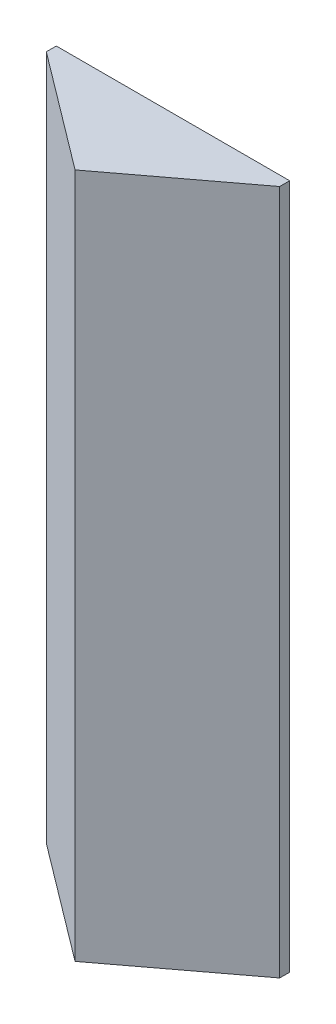
ISO-10303-21;
HEADER;
FILE_DESCRIPTION(('STEP AP214'),'2;1');
FILE_NAME('part.step','',(''),(''),'','','');
FILE_SCHEMA(('AUTOMOTIVE_DESIGN { 1 0 10303 214 1 1 1 1 }'));
ENDSEC;
DATA;
#1=APPLICATION_CONTEXT('core data for automotive mechanical design processes');
#2=APPLICATION_PROTOCOL_DEFINITION('international standard','automotive_design',2000,#1);
#3=PRODUCT_CONTEXT('',#1,'mechanical');
#4=PRODUCT('Part','Part','',(#3));
#5=PRODUCT_RELATED_PRODUCT_CATEGORY('part','',(#4));
#6=PRODUCT_DEFINITION_FORMATION('','',#4);
#7=PRODUCT_DEFINITION_CONTEXT('part definition',#1,'design');
#8=PRODUCT_DEFINITION('design','',#6,#7);
#9=PRODUCT_DEFINITION_SHAPE('','',#8);
#10=(LENGTH_UNIT() NAMED_UNIT(*) SI_UNIT(.MILLI.,.METRE.));
#11=(NAMED_UNIT(*) PLANE_ANGLE_UNIT() SI_UNIT($,.RADIAN.));
#12=(NAMED_UNIT(*) SI_UNIT($,.STERADIAN.) SOLID_ANGLE_UNIT());
#13=UNCERTAINTY_MEASURE_WITH_UNIT(LENGTH_MEASURE(1.E-05),#10,'distance_accuracy_value','');
#14=(GEOMETRIC_REPRESENTATION_CONTEXT(3) GLOBAL_UNCERTAINTY_ASSIGNED_CONTEXT((#13)) GLOBAL_UNIT_ASSIGNED_CONTEXT((#10,
#11,#12)) REPRESENTATION_CONTEXT('',''));
#15=CARTESIAN_POINT('',(0.,0.,0.));
#16=DIRECTION('',(0.,0.,1.));
#17=DIRECTION('',(1.,0.,0.));
#18=AXIS2_PLACEMENT_3D('',#15,#16,#17);
#19=CARTESIAN_POINT('',(0.,1375.,-629.85));
#20=DIRECTION('',(0.,-1.,0.));
#21=DIRECTION('',(1.,0.,0.));
#22=AXIS2_PLACEMENT_3D('',#19,#20,#21);
#23=PLANE('',#22);
#24=DIRECTION('',(0.,0.,1.));
#25=VECTOR('',#24,1.);
#26=CARTESIAN_POINT('',(-357.5,1375.,-614.85));
#27=LINE('',#26,#25);
#28=CARTESIAN_POINT('',(-357.5,1375.,-614.85));
#29=VERTEX_POINT('',#28);
#30=CARTESIAN_POINT('',(-357.5,1375.,-584.245572911746));
#31=VERTEX_POINT('',#30);
#32=EDGE_CURVE('E11',#29,#31,#27,.T.);
#33=ORIENTED_EDGE('',*,*,#32,.T.);
#34=DIRECTION('',(0.798635510047319,0.,0.601815023152014));
#35=VECTOR('',#34,1.);
#36=CARTESIAN_POINT('',(-357.5,1375.,-584.245572911746));
#37=LINE('',#36,#35);
#38=CARTESIAN_POINT('',(0.,1375.,-314.85));
#39=VERTEX_POINT('',#38);
#40=EDGE_CURVE('E28',#31,#39,#37,.T.);
#41=ORIENTED_EDGE('',*,*,#40,.T.);
#42=DIRECTION('',(0.798635510047319,0.,-0.601815023152014));
#43=VECTOR('',#42,1.);
#44=CARTESIAN_POINT('',(0.,1375.,-314.85));
#45=LINE('',#44,#43);
#46=CARTESIAN_POINT('',(357.5,1375.,-584.245572911746));
#47=VERTEX_POINT('',#46);
#48=EDGE_CURVE('E104',#39,#47,#45,.T.);
#49=ORIENTED_EDGE('',*,*,#48,.T.);
#50=DIRECTION('',(0.,0.,-1.));
#51=VECTOR('',#50,1.);
#52=CARTESIAN_POINT('',(357.5,1375.,-584.245572911746));
#53=LINE('',#52,#51);
#54=CARTESIAN_POINT('',(357.5,1375.,-614.85));
#55=VERTEX_POINT('',#54);
#56=EDGE_CURVE('E108',#47,#55,#53,.T.);
#57=ORIENTED_EDGE('',*,*,#56,.T.);
#58=DIRECTION('',(-1.,0.,0.));
#59=VECTOR('',#58,1.);
#60=CARTESIAN_POINT('',(357.5,1375.,-614.85));
#61=LINE('',#60,#59);
#62=EDGE_CURVE('E101',#55,#29,#61,.T.);
#63=ORIENTED_EDGE('',*,*,#62,.T.);
#64=EDGE_LOOP('',(#33,#41,#49,#57,#63));
#65=FACE_BOUND('',#64,.T.);
#66=ADVANCED_FACE('F17',(#65),#23,.F.);
#67=CARTESIAN_POINT('',(357.5,390.,-614.85));
#68=DIRECTION('',(0.,0.,-1.));
#69=DIRECTION('',(0.,1.,0.));
#70=AXIS2_PLACEMENT_3D('',#67,#68,#69);
#71=PLANE('',#70);
#72=ORIENTED_EDGE('',*,*,#62,.F.);
#73=DIRECTION('',(0.,-1.,0.));
#74=VECTOR('',#73,1.);
#75=CARTESIAN_POINT('',(357.5,1375.,-614.85));
#76=LINE('',#75,#74);
#77=CARTESIAN_POINT('',(357.5,-725.,-614.85));
#78=VERTEX_POINT('',#77);
#79=EDGE_CURVE('E97',#55,#78,#76,.T.);
#80=ORIENTED_EDGE('',*,*,#79,.T.);
#81=DIRECTION('',(1.,0.,0.));
#82=VECTOR('',#81,1.);
#83=CARTESIAN_POINT('',(-357.5,-725.,-614.85));
#84=LINE('',#83,#82);
#85=CARTESIAN_POINT('',(-357.5,-725.,-614.85));
#86=VERTEX_POINT('',#85);
#87=EDGE_CURVE('E81',#86,#78,#84,.T.);
#88=ORIENTED_EDGE('',*,*,#87,.F.);
#89=DIRECTION('',(0.,-1.,0.));
#90=VECTOR('',#89,1.);
#91=CARTESIAN_POINT('',(-357.5,1375.,-614.85));
#92=LINE('',#91,#90);
#93=EDGE_CURVE('E76',#29,#86,#92,.T.);
#94=ORIENTED_EDGE('',*,*,#93,.F.);
#95=EDGE_LOOP('',(#72,#80,#88,#94));
#96=FACE_BOUND('',#95,.T.);
#97=ADVANCED_FACE('F19',(#96),#71,.T.);
#98=CARTESIAN_POINT('',(-357.5,390.,-614.85));
#99=DIRECTION('',(-1.,0.,0.));
#100=DIRECTION('',(0.,-1.,0.));
#101=AXIS2_PLACEMENT_3D('',#98,#99,#100);
#102=PLANE('',#101);
#103=ORIENTED_EDGE('',*,*,#32,.F.);
#104=ORIENTED_EDGE('',*,*,#93,.T.);
#105=DIRECTION('',(0.,0.,-1.));
#106=VECTOR('',#105,1.);
#107=CARTESIAN_POINT('',(-357.5,-725.,-584.245572911746));
#108=LINE('',#107,#106);
#109=CARTESIAN_POINT('',(-357.5,-725.,-584.245572911746));
#110=VERTEX_POINT('',#109);
#111=EDGE_CURVE('E71',#110,#86,#108,.T.);
#112=ORIENTED_EDGE('',*,*,#111,.F.);
#113=DIRECTION('',(0.,-1.,0.));
#114=VECTOR('',#113,1.);
#115=CARTESIAN_POINT('',(-357.5,1375.,-584.245572911746));
#116=LINE('',#115,#114);
#117=EDGE_CURVE('E74',#31,#110,#116,.T.);
#118=ORIENTED_EDGE('',*,*,#117,.F.);
#119=EDGE_LOOP('',(#103,#104,#112,#118));
#120=FACE_BOUND('',#119,.T.);
#121=ADVANCED_FACE('F73',(#120),#102,.T.);
#122=CARTESIAN_POINT('',(-357.5,390.,-584.245572911746));
#123=DIRECTION('',(-0.601815023152014,0.,0.798635510047319));
#124=DIRECTION('',(0.,-1.,0.));
#125=AXIS2_PLACEMENT_3D('',#122,#123,#124);
#126=PLANE('',#125);
#127=ORIENTED_EDGE('',*,*,#40,.F.);
#128=ORIENTED_EDGE('',*,*,#117,.T.);
#129=DIRECTION('',(-0.798635510047319,0.,-0.601815023152014));
#130=VECTOR('',#129,1.);
#131=CARTESIAN_POINT('',(0.,-725.,-314.85));
#132=LINE('',#131,#130);
#133=CARTESIAN_POINT('',(0.,-725.,-314.85));
#134=VERTEX_POINT('',#133);
#135=EDGE_CURVE('E63',#134,#110,#132,.T.);
#136=ORIENTED_EDGE('',*,*,#135,.F.);
#137=DIRECTION('',(0.,1.,0.));
#138=VECTOR('',#137,1.);
#139=CARTESIAN_POINT('',(0.,-725.,-314.85));
#140=LINE('',#139,#138);
#141=EDGE_CURVE('E21',#134,#39,#140,.T.);
#142=ORIENTED_EDGE('',*,*,#141,.T.);
#143=EDGE_LOOP('',(#127,#128,#136,#142));
#144=FACE_BOUND('',#143,.T.);
#145=ADVANCED_FACE('F83',(#144),#126,.T.);
#146=CARTESIAN_POINT('',(0.,390.,-314.85));
#147=DIRECTION('',(0.601815023152014,0.,0.798635510047319));
#148=DIRECTION('',(0.,1.,0.));
#149=AXIS2_PLACEMENT_3D('',#146,#147,#148);
#150=PLANE('',#149);
#151=ORIENTED_EDGE('',*,*,#48,.F.);
#152=ORIENTED_EDGE('',*,*,#141,.F.);
#153=DIRECTION('',(-0.798635510047319,0.,0.601815023152014));
#154=VECTOR('',#153,1.);
#155=CARTESIAN_POINT('',(357.5,-725.,-584.245572911746));
#156=LINE('',#155,#154);
#157=CARTESIAN_POINT('',(357.5,-725.,-584.245572911746));
#158=VERTEX_POINT('',#157);
#159=EDGE_CURVE('E89',#158,#134,#156,.T.);
#160=ORIENTED_EDGE('',*,*,#159,.F.);
#161=DIRECTION('',(0.,-1.,0.));
#162=VECTOR('',#161,1.);
#163=CARTESIAN_POINT('',(357.5,1375.,-584.245572911746));
#164=LINE('',#163,#162);
#165=EDGE_CURVE('E80',#47,#158,#164,.T.);
#166=ORIENTED_EDGE('',*,*,#165,.F.);
#167=EDGE_LOOP('',(#151,#152,#160,#166));
#168=FACE_BOUND('',#167,.T.);
#169=ADVANCED_FACE('F143',(#168),#150,.T.);
#170=CARTESIAN_POINT('',(357.5,390.,-584.245572911746));
#171=DIRECTION('',(1.,0.,0.));
#172=DIRECTION('',(0.,0.,1.));
#173=AXIS2_PLACEMENT_3D('',#170,#171,#172);
#174=PLANE('',#173);
#175=ORIENTED_EDGE('',*,*,#56,.F.);
#176=ORIENTED_EDGE('',*,*,#165,.T.);
#177=DIRECTION('',(0.,0.,1.));
#178=VECTOR('',#177,1.);
#179=CARTESIAN_POINT('',(357.5,-725.,-614.85));
#180=LINE('',#179,#178);
#181=EDGE_CURVE('E93',#78,#158,#180,.T.);
#182=ORIENTED_EDGE('',*,*,#181,.F.);
#183=ORIENTED_EDGE('',*,*,#79,.F.);
#184=EDGE_LOOP('',(#175,#176,#182,#183));
#185=FACE_BOUND('',#184,.T.);
#186=ADVANCED_FACE('F145',(#185),#174,.T.);
#187=CARTESIAN_POINT('',(288.0537497145,-725.,-494.35));
#188=DIRECTION('',(0.,-1.,0.));
#189=DIRECTION('',(1.,0.,0.));
#190=AXIS2_PLACEMENT_3D('',#187,#188,#189);
#191=PLANE('',#190);
#192=ORIENTED_EDGE('',*,*,#111,.T.);
#193=ORIENTED_EDGE('',*,*,#87,.T.);
#194=ORIENTED_EDGE('',*,*,#181,.T.);
#195=ORIENTED_EDGE('',*,*,#159,.T.);
#196=ORIENTED_EDGE('',*,*,#135,.T.);
#197=EDGE_LOOP('',(#192,#193,#194,#195,#196));
#198=FACE_BOUND('',#197,.T.);
#199=ADVANCED_FACE('F87',(#198),#191,.T.);
#200=CLOSED_SHELL('',(#66,#97,#121,#145,#169,#186,#199));
#201=MANIFOLD_SOLID_BREP('B1',#200);
#202=ADVANCED_BREP_SHAPE_REPRESENTATION('',(#18,#201),#14);
#203=SHAPE_DEFINITION_REPRESENTATION(#9,#202);
ENDSEC;
END-ISO-10303-21;
